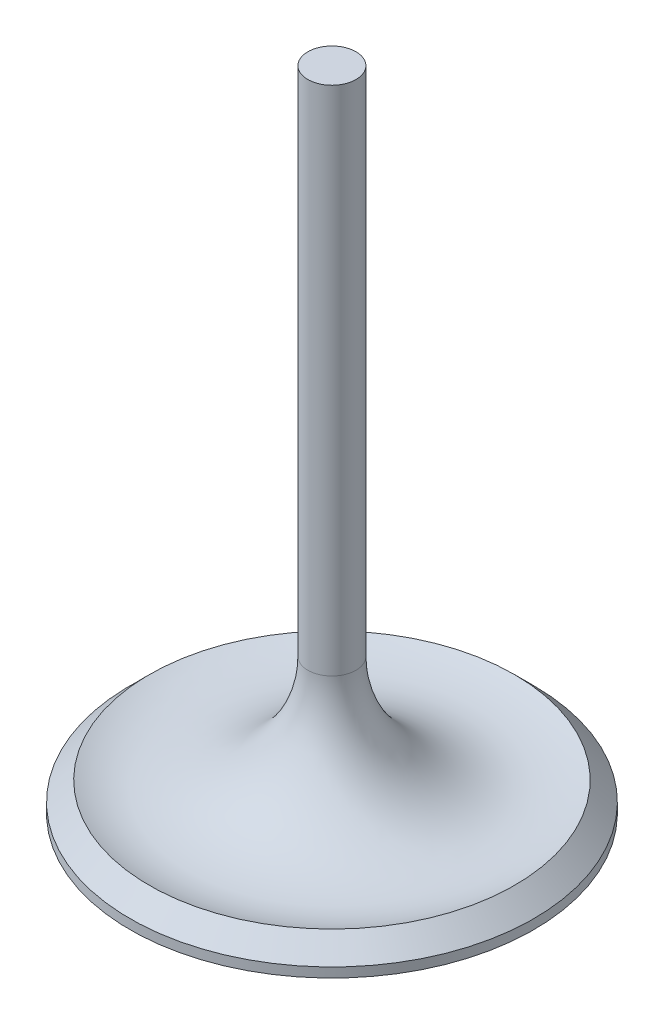
ISO-10303-21;
HEADER;
FILE_DESCRIPTION(('STEP AP214'),'2;1');
FILE_NAME('part.step','',(''),(''),'','','');
FILE_SCHEMA(('AUTOMOTIVE_DESIGN { 1 0 10303 214 1 1 1 1 }'));
ENDSEC;
DATA;
#1=APPLICATION_CONTEXT('core data for automotive mechanical design processes');
#2=APPLICATION_PROTOCOL_DEFINITION('international standard','automotive_design',2000,#1);
#3=PRODUCT_CONTEXT('',#1,'mechanical');
#4=PRODUCT('Part','Part','',(#3));
#5=PRODUCT_RELATED_PRODUCT_CATEGORY('part','',(#4));
#6=PRODUCT_DEFINITION_FORMATION('','',#4);
#7=PRODUCT_DEFINITION_CONTEXT('part definition',#1,'design');
#8=PRODUCT_DEFINITION('design','',#6,#7);
#9=PRODUCT_DEFINITION_SHAPE('','',#8);
#10=(LENGTH_UNIT() NAMED_UNIT(*) SI_UNIT(.MILLI.,.METRE.));
#11=(NAMED_UNIT(*) PLANE_ANGLE_UNIT() SI_UNIT($,.RADIAN.));
#12=(NAMED_UNIT(*) SI_UNIT($,.STERADIAN.) SOLID_ANGLE_UNIT());
#13=UNCERTAINTY_MEASURE_WITH_UNIT(LENGTH_MEASURE(1.E-05),#10,'distance_accuracy_value','');
#14=(GEOMETRIC_REPRESENTATION_CONTEXT(3) GLOBAL_UNCERTAINTY_ASSIGNED_CONTEXT((#13)) GLOBAL_UNIT_ASSIGNED_CONTEXT((#10,
#11,#12)) REPRESENTATION_CONTEXT('',''));
#15=CARTESIAN_POINT('',(0.,0.,0.));
#16=DIRECTION('',(0.,0.,1.));
#17=DIRECTION('',(1.,0.,0.));
#18=AXIS2_PLACEMENT_3D('',#15,#16,#17);
#19=CARTESIAN_POINT('',(26.67,0.,0.));
#20=DIRECTION('',(0.,-1.,0.));
#21=DIRECTION('',(0.,0.,-1.));
#22=AXIS2_PLACEMENT_3D('',#19,#20,#21);
#23=PLANE('',#22);
#24=CARTESIAN_POINT('',(0.,0.,0.));
#25=DIRECTION('',(0.,-1.,0.));
#26=DIRECTION('',(0.,0.,-1.));
#27=AXIS2_PLACEMENT_3D('',#24,#25,#26);
#28=CIRCLE('',#27,26.67);
#29=CARTESIAN_POINT('',(0.,0.,-26.67));
#30=VERTEX_POINT('',#29);
#31=EDGE_CURVE('E10',#30,#30,#28,.T.);
#32=ORIENTED_EDGE('',*,*,#31,.T.);
#33=EDGE_LOOP('',(#32));
#34=FACE_BOUND('',#33,.T.);
#35=ADVANCED_FACE('F41',(#34),#23,.T.);
#36=CARTESIAN_POINT('',(0.,0.,0.));
#37=DIRECTION('',(0.,-1.,0.));
#38=DIRECTION('',(0.,0.,-1.));
#39=AXIS2_PLACEMENT_3D('',#36,#37,#38);
#40=CYLINDRICAL_SURFACE('',#39,26.67);
#41=CARTESIAN_POINT('',(0.,1.27,0.));
#42=DIRECTION('',(0.,-1.,0.));
#43=DIRECTION('',(0.,0.,-1.));
#44=AXIS2_PLACEMENT_3D('',#41,#42,#43);
#45=CIRCLE('',#44,26.67);
#46=CARTESIAN_POINT('',(0.,1.27,-26.67));
#47=VERTEX_POINT('',#46);
#48=EDGE_CURVE('E48',#47,#47,#45,.T.);
#49=ORIENTED_EDGE('',*,*,#48,.T.);
#50=EDGE_LOOP('',(#49));
#51=FACE_BOUND('',#50,.T.);
#52=ORIENTED_EDGE('',*,*,#31,.F.);
#53=EDGE_LOOP('',(#52));
#54=FACE_BOUND('',#53,.T.);
#55=ADVANCED_FACE('F81',(#51,#54),#40,.T.);
#56=CARTESIAN_POINT('',(0.,1.27,0.));
#57=DIRECTION('',(0.,-1.,0.));
#58=DIRECTION('',(0.,0.,-1.));
#59=AXIS2_PLACEMENT_3D('',#56,#57,#58);
#60=CONICAL_SURFACE('',#59,26.67,0.785398163397456);
#61=CARTESIAN_POINT('',(0.,3.80999999999999,0.));
#62=DIRECTION('',(0.,-1.,0.));
#63=DIRECTION('',(0.,0.,-1.));
#64=AXIS2_PLACEMENT_3D('',#61,#62,#63);
#65=CIRCLE('',#64,24.13);
#66=CARTESIAN_POINT('',(0.,3.80999999999999,-24.13));
#67=VERTEX_POINT('',#66);
#68=EDGE_CURVE('E53',#67,#67,#65,.T.);
#69=ORIENTED_EDGE('',*,*,#68,.T.);
#70=EDGE_LOOP('',(#69));
#71=FACE_BOUND('',#70,.T.);
#72=ORIENTED_EDGE('',*,*,#48,.F.);
#73=EDGE_LOOP('',(#72));
#74=FACE_BOUND('',#73,.T.);
#75=ADVANCED_FACE('F85',(#71,#74),#60,.T.);
#76=CARTESIAN_POINT('',(0.,17.9546986535592,0.));
#77=DIRECTION('',(0.,-1.,0.));
#78=DIRECTION('',(0.,0.,-1.));
#79=AXIS2_PLACEMENT_3D('',#76,#77,#78);
#80=TOROIDAL_SURFACE('',#79,18.43,15.25);
#81=CARTESIAN_POINT('',(0.,17.9546986535592,0.));
#82=DIRECTION('',(0.,-1.,0.));
#83=DIRECTION('',(0.,0.,-1.));
#84=AXIS2_PLACEMENT_3D('',#81,#82,#83);
#85=CIRCLE('',#84,3.18000000000001);
#86=CARTESIAN_POINT('',(0.,17.9546986535592,-3.18000000000001));
#87=VERTEX_POINT('',#86);
#88=EDGE_CURVE('E58',#87,#87,#85,.T.);
#89=ORIENTED_EDGE('',*,*,#88,.T.);
#90=EDGE_LOOP('',(#89));
#91=FACE_BOUND('',#90,.T.);
#92=ORIENTED_EDGE('',*,*,#68,.F.);
#93=EDGE_LOOP('',(#92));
#94=FACE_BOUND('',#93,.T.);
#95=ADVANCED_FACE('F78',(#91,#94),#80,.F.);
#96=CARTESIAN_POINT('',(0.,0.,0.));
#97=DIRECTION('',(0.,-1.,0.));
#98=DIRECTION('',(0.,0.,-1.));
#99=AXIS2_PLACEMENT_3D('',#96,#97,#98);
#100=CYLINDRICAL_SURFACE('',#99,3.18000000000001);
#101=CARTESIAN_POINT('',(0.,85.55,0.));
#102=DIRECTION('',(0.,-1.,0.));
#103=DIRECTION('',(0.,0.,-1.));
#104=AXIS2_PLACEMENT_3D('',#101,#102,#103);
#105=CIRCLE('',#104,3.18);
#106=CARTESIAN_POINT('',(0.,85.55,-3.18));
#107=VERTEX_POINT('',#106);
#108=EDGE_CURVE('E64',#107,#107,#105,.T.);
#109=ORIENTED_EDGE('',*,*,#108,.T.);
#110=EDGE_LOOP('',(#109));
#111=FACE_BOUND('',#110,.T.);
#112=ORIENTED_EDGE('',*,*,#88,.F.);
#113=EDGE_LOOP('',(#112));
#114=FACE_BOUND('',#113,.T.);
#115=ADVANCED_FACE('F69',(#111,#114),#100,.T.);
#116=CARTESIAN_POINT('',(0.,85.55,0.));
#117=DIRECTION('',(0.,1.,0.));
#118=DIRECTION('',(0.,0.,1.));
#119=AXIS2_PLACEMENT_3D('',#116,#117,#118);
#120=PLANE('',#119);
#121=ORIENTED_EDGE('',*,*,#108,.F.);
#122=EDGE_LOOP('',(#121));
#123=FACE_BOUND('',#122,.T.);
#124=ADVANCED_FACE('F72',(#123),#120,.T.);
#125=CLOSED_SHELL('',(#35,#55,#75,#95,#115,#124));
#126=MANIFOLD_SOLID_BREP('B2',#125);
#127=ADVANCED_BREP_SHAPE_REPRESENTATION('',(#18,#126),#14);
#128=SHAPE_DEFINITION_REPRESENTATION(#9,#127);
ENDSEC;
END-ISO-10303-21;
